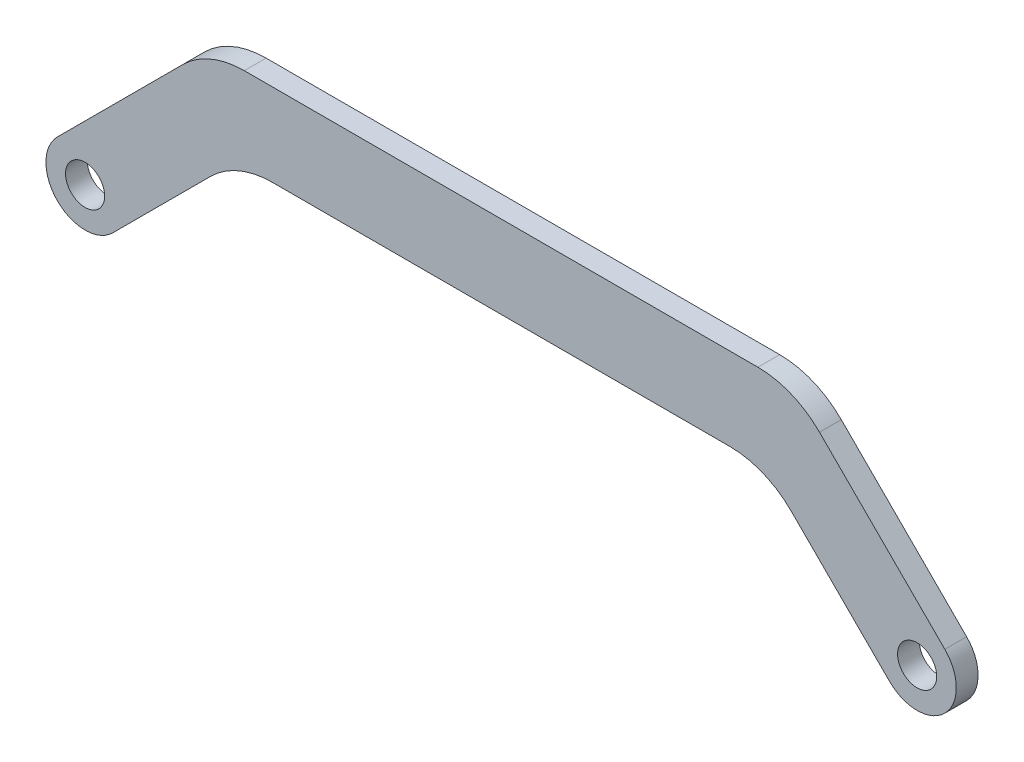
ISO-10303-21;
HEADER;
FILE_DESCRIPTION(('STEP AP214'),'2;1');
FILE_NAME('part.step','',(''),(''),'','','');
FILE_SCHEMA(('AUTOMOTIVE_DESIGN { 1 0 10303 214 1 1 1 1 }'));
ENDSEC;
DATA;
#1=APPLICATION_CONTEXT('core data for automotive mechanical design processes');
#2=APPLICATION_PROTOCOL_DEFINITION('international standard','automotive_design',2000,#1);
#3=PRODUCT_CONTEXT('',#1,'mechanical');
#4=PRODUCT('Part','Part','',(#3));
#5=PRODUCT_RELATED_PRODUCT_CATEGORY('part','',(#4));
#6=PRODUCT_DEFINITION_FORMATION('','',#4);
#7=PRODUCT_DEFINITION_CONTEXT('part definition',#1,'design');
#8=PRODUCT_DEFINITION('design','',#6,#7);
#9=PRODUCT_DEFINITION_SHAPE('','',#8);
#10=(LENGTH_UNIT() NAMED_UNIT(*) SI_UNIT(.MILLI.,.METRE.));
#11=(NAMED_UNIT(*) PLANE_ANGLE_UNIT() SI_UNIT($,.RADIAN.));
#12=(NAMED_UNIT(*) SI_UNIT($,.STERADIAN.) SOLID_ANGLE_UNIT());
#13=UNCERTAINTY_MEASURE_WITH_UNIT(LENGTH_MEASURE(1.E-05),#10,'distance_accuracy_value','');
#14=(GEOMETRIC_REPRESENTATION_CONTEXT(3) GLOBAL_UNCERTAINTY_ASSIGNED_CONTEXT((#13)) GLOBAL_UNIT_ASSIGNED_CONTEXT((#10,
#11,#12)) REPRESENTATION_CONTEXT('',''));
#15=CARTESIAN_POINT('',(0.,0.,0.));
#16=DIRECTION('',(0.,0.,1.));
#17=DIRECTION('',(1.,0.,0.));
#18=AXIS2_PLACEMENT_3D('',#15,#16,#17);
#19=CARTESIAN_POINT('',(0.,0.,5.));
#20=DIRECTION('',(0.,0.,1.));
#21=DIRECTION('',(1.,0.,0.));
#22=AXIS2_PLACEMENT_3D('',#19,#20,#21);
#23=PLANE('',#22);
#24=CARTESIAN_POINT('',(0.,0.,5.));
#25=DIRECTION('',(0.,0.,1.));
#26=DIRECTION('',(1.,0.,0.));
#27=AXIS2_PLACEMENT_3D('',#24,#25,#26);
#28=CIRCLE('',#27,4.49);
#29=CARTESIAN_POINT('',(4.49,0.,5.));
#30=VERTEX_POINT('',#29);
#31=EDGE_CURVE('E279',#30,#30,#28,.T.);
#32=ORIENTED_EDGE('',*,*,#31,.F.);
#33=EDGE_LOOP('',(#32));
#34=FACE_BOUND('',#33,.T.);
#35=DIRECTION('',(-0.707106781186546,0.707106781186549,0.));
#36=VECTOR('',#35,1.);
#37=CARTESIAN_POINT('',(197.356889962867,6.35688996286705,5.));
#38=LINE('',#37,#36);
#39=CARTESIAN_POINT('',(197.356889962867,6.35688996286705,5.));
#40=VERTEX_POINT('',#39);
#41=CARTESIAN_POINT('',(168.591644302003,35.1221356237309,5.));
#42=VERTEX_POINT('',#41);
#43=EDGE_CURVE('E256',#40,#42,#38,.T.);
#44=ORIENTED_EDGE('',*,*,#43,.T.);
#45=CARTESIAN_POINT('',(154.449508678272,20.98,5.));
#46=DIRECTION('',(0.,0.,1.));
#47=DIRECTION('',(1.,0.,0.));
#48=AXIS2_PLACEMENT_3D('',#45,#46,#47);
#49=CIRCLE('',#48,20.);
#50=CARTESIAN_POINT('',(154.449508678272,40.98,5.));
#51=VERTEX_POINT('',#50);
#52=EDGE_CURVE('E204',#42,#51,#49,.T.);
#53=ORIENTED_EDGE('',*,*,#52,.T.);
#54=DIRECTION('',(-1.,0.,0.));
#55=VECTOR('',#54,1.);
#56=CARTESIAN_POINT('',(28.2662200742657,40.98,5.));
#57=LINE('',#56,#55);
#58=CARTESIAN_POINT('',(36.5504913217277,40.98,5.));
#59=VERTEX_POINT('',#58);
#60=EDGE_CURVE('E266',#51,#59,#57,.T.);
#61=ORIENTED_EDGE('',*,*,#60,.T.);
#62=CARTESIAN_POINT('',(36.5504913217277,20.98,5.));
#63=DIRECTION('',(0.,0.,1.));
#64=DIRECTION('',(1.,0.,0.));
#65=AXIS2_PLACEMENT_3D('',#62,#63,#64);
#66=CIRCLE('',#65,20.);
#67=CARTESIAN_POINT('',(22.4083556979967,35.1221356237309,5.));
#68=VERTEX_POINT('',#67);
#69=EDGE_CURVE('E179',#59,#68,#66,.T.);
#70=ORIENTED_EDGE('',*,*,#69,.T.);
#71=DIRECTION('',(-0.707106781186546,-0.707106781186549,0.));
#72=VECTOR('',#71,1.);
#73=CARTESIAN_POINT('',(-6.35688996286707,6.35688996286705,5.));
#74=LINE('',#73,#72);
#75=CARTESIAN_POINT('',(-6.35688996286707,6.35688996286705,5.));
#76=VERTEX_POINT('',#75);
#77=EDGE_CURVE('E148',#68,#76,#74,.T.);
#78=ORIENTED_EDGE('',*,*,#77,.T.);
#79=CARTESIAN_POINT('',(0.,0.,5.));
#80=DIRECTION('',(0.,0.,1.));
#81=DIRECTION('',(1.,0.,0.));
#82=AXIS2_PLACEMENT_3D('',#79,#80,#81);
#83=CIRCLE('',#82,8.99);
#84=CARTESIAN_POINT('',(6.35688996286707,-6.35688996286705,5.));
#85=VERTEX_POINT('',#84);
#86=EDGE_CURVE('E142',#76,#85,#83,.T.);
#87=ORIENTED_EDGE('',*,*,#86,.T.);
#88=DIRECTION('',(0.707106781186546,0.707106781186549,0.));
#89=VECTOR('',#88,1.);
#90=CARTESIAN_POINT('',(6.35688996286707,-6.35688996286705,5.));
#91=LINE('',#90,#89);
#92=CARTESIAN_POINT('',(28.855915549465,16.1421356237309,5.));
#93=VERTEX_POINT('',#92);
#94=EDGE_CURVE('E129',#85,#93,#91,.T.);
#95=ORIENTED_EDGE('',*,*,#94,.T.);
#96=CARTESIAN_POINT('',(42.9980511731959,1.99999999999999,5.));
#97=DIRECTION('',(0.,0.,1.));
#98=DIRECTION('',(1.,0.,0.));
#99=AXIS2_PLACEMENT_3D('',#96,#97,#98);
#100=CIRCLE('',#99,20.);
#101=CARTESIAN_POINT('',(42.9980511731959,22.,5.));
#102=VERTEX_POINT('',#101);
#103=EDGE_CURVE('E191',#93,#102,#100,.F.);
#104=ORIENTED_EDGE('',*,*,#103,.T.);
#105=DIRECTION('',(1.,0.,0.));
#106=VECTOR('',#105,1.);
#107=CARTESIAN_POINT('',(34.713779925734,22.,5.));
#108=LINE('',#107,#106);
#109=CARTESIAN_POINT('',(148.001948826804,22.,5.));
#110=VERTEX_POINT('',#109);
#111=EDGE_CURVE('E141',#102,#110,#108,.T.);
#112=ORIENTED_EDGE('',*,*,#111,.T.);
#113=CARTESIAN_POINT('',(148.001948826804,1.99999999999999,5.));
#114=DIRECTION('',(0.,0.,1.));
#115=DIRECTION('',(1.,0.,0.));
#116=AXIS2_PLACEMENT_3D('',#113,#114,#115);
#117=CIRCLE('',#116,20.);
#118=CARTESIAN_POINT('',(162.144084450535,16.1421356237309,5.));
#119=VERTEX_POINT('',#118);
#120=EDGE_CURVE('E11',#110,#119,#117,.F.);
#121=ORIENTED_EDGE('',*,*,#120,.T.);
#122=DIRECTION('',(0.707106781186546,-0.707106781186549,0.));
#123=VECTOR('',#122,1.);
#124=CARTESIAN_POINT('',(184.643110037133,-6.35688996286705,5.));
#125=LINE('',#124,#123);
#126=CARTESIAN_POINT('',(184.643110037133,-6.35688996286705,5.));
#127=VERTEX_POINT('',#126);
#128=EDGE_CURVE('E219',#119,#127,#125,.T.);
#129=ORIENTED_EDGE('',*,*,#128,.T.);
#130=CARTESIAN_POINT('',(191.,0.,5.));
#131=DIRECTION('',(0.,0.,1.));
#132=DIRECTION('',(1.,0.,0.));
#133=AXIS2_PLACEMENT_3D('',#130,#131,#132);
#134=CIRCLE('',#133,8.98999999999999);
#135=EDGE_CURVE('E274',#127,#40,#134,.T.);
#136=ORIENTED_EDGE('',*,*,#135,.T.);
#137=EDGE_LOOP('',(#44,#53,#61,#70,#78,#87,#95,#104,#112,#121,#129,#136));
#138=FACE_BOUND('',#137,.T.);
#139=CARTESIAN_POINT('',(191.,0.,5.));
#140=DIRECTION('',(0.,0.,1.));
#141=DIRECTION('',(1.,0.,0.));
#142=AXIS2_PLACEMENT_3D('',#139,#140,#141);
#143=CIRCLE('',#142,4.48999999999998);
#144=CARTESIAN_POINT('',(195.49,0.,5.));
#145=VERTEX_POINT('',#144);
#146=EDGE_CURVE('E432',#145,#145,#143,.T.);
#147=ORIENTED_EDGE('',*,*,#146,.F.);
#148=EDGE_LOOP('',(#147));
#149=FACE_BOUND('',#148,.T.);
#150=ADVANCED_FACE('F39',(#34,#138,#149),#23,.T.);
#151=CARTESIAN_POINT('',(0.,0.,0.));
#152=DIRECTION('',(0.,0.,1.));
#153=DIRECTION('',(1.,0.,0.));
#154=AXIS2_PLACEMENT_3D('',#151,#152,#153);
#155=PLANE('',#154);
#156=DIRECTION('',(-1.,0.,0.));
#157=VECTOR('',#156,1.);
#158=CARTESIAN_POINT('',(28.2662200742657,40.98,0.));
#159=LINE('',#158,#157);
#160=CARTESIAN_POINT('',(154.449508678272,40.98,0.));
#161=VERTEX_POINT('',#160);
#162=CARTESIAN_POINT('',(36.5504913217277,40.98,0.));
#163=VERTEX_POINT('',#162);
#164=EDGE_CURVE('E242',#161,#163,#159,.T.);
#165=ORIENTED_EDGE('',*,*,#164,.F.);
#166=CARTESIAN_POINT('',(154.449508678272,20.98,0.));
#167=DIRECTION('',(0.,0.,1.));
#168=DIRECTION('',(1.,0.,0.));
#169=AXIS2_PLACEMENT_3D('',#166,#167,#168);
#170=CIRCLE('',#169,20.);
#171=CARTESIAN_POINT('',(168.591644302003,35.1221356237309,0.));
#172=VERTEX_POINT('',#171);
#173=EDGE_CURVE('E198',#161,#172,#170,.F.);
#174=ORIENTED_EDGE('',*,*,#173,.T.);
#175=DIRECTION('',(-0.707106781186546,0.707106781186549,0.));
#176=VECTOR('',#175,1.);
#177=CARTESIAN_POINT('',(197.356889962867,6.35688996286705,0.));
#178=LINE('',#177,#176);
#179=CARTESIAN_POINT('',(197.356889962867,6.35688996286705,0.));
#180=VERTEX_POINT('',#179);
#181=EDGE_CURVE('E233',#180,#172,#178,.T.);
#182=ORIENTED_EDGE('',*,*,#181,.F.);
#183=CARTESIAN_POINT('',(191.,0.,0.));
#184=DIRECTION('',(0.,0.,1.));
#185=DIRECTION('',(1.,0.,0.));
#186=AXIS2_PLACEMENT_3D('',#183,#184,#185);
#187=CIRCLE('',#186,8.98999999999999);
#188=CARTESIAN_POINT('',(184.643110037133,-6.35688996286705,0.));
#189=VERTEX_POINT('',#188);
#190=EDGE_CURVE('E227',#189,#180,#187,.T.);
#191=ORIENTED_EDGE('',*,*,#190,.F.);
#192=DIRECTION('',(0.707106781186546,-0.707106781186549,0.));
#193=VECTOR('',#192,1.);
#194=CARTESIAN_POINT('',(184.643110037133,-6.35688996286705,0.));
#195=LINE('',#194,#193);
#196=CARTESIAN_POINT('',(162.144084450535,16.1421356237309,0.));
#197=VERTEX_POINT('',#196);
#198=EDGE_CURVE('E218',#197,#189,#195,.T.);
#199=ORIENTED_EDGE('',*,*,#198,.F.);
#200=CARTESIAN_POINT('',(148.001948826804,1.99999999999999,0.));
#201=DIRECTION('',(0.,0.,1.));
#202=DIRECTION('',(1.,0.,0.));
#203=AXIS2_PLACEMENT_3D('',#200,#201,#202);
#204=CIRCLE('',#203,20.);
#205=CARTESIAN_POINT('',(148.001948826804,22.,0.));
#206=VERTEX_POINT('',#205);
#207=EDGE_CURVE('E48',#197,#206,#204,.T.);
#208=ORIENTED_EDGE('',*,*,#207,.T.);
#209=DIRECTION('',(1.,0.,0.));
#210=VECTOR('',#209,1.);
#211=CARTESIAN_POINT('',(34.713779925734,22.,0.));
#212=LINE('',#211,#210);
#213=CARTESIAN_POINT('',(42.9980511731959,22.,0.));
#214=VERTEX_POINT('',#213);
#215=EDGE_CURVE('E229',#214,#206,#212,.T.);
#216=ORIENTED_EDGE('',*,*,#215,.F.);
#217=CARTESIAN_POINT('',(42.9980511731959,1.99999999999999,0.));
#218=DIRECTION('',(0.,0.,1.));
#219=DIRECTION('',(1.,0.,0.));
#220=AXIS2_PLACEMENT_3D('',#217,#218,#219);
#221=CIRCLE('',#220,20.);
#222=CARTESIAN_POINT('',(28.855915549465,16.1421356237309,0.));
#223=VERTEX_POINT('',#222);
#224=EDGE_CURVE('E188',#214,#223,#221,.T.);
#225=ORIENTED_EDGE('',*,*,#224,.T.);
#226=DIRECTION('',(0.707106781186546,0.707106781186549,0.));
#227=VECTOR('',#226,1.);
#228=CARTESIAN_POINT('',(6.35688996286707,-6.35688996286705,0.));
#229=LINE('',#228,#227);
#230=CARTESIAN_POINT('',(6.35688996286707,-6.35688996286705,0.));
#231=VERTEX_POINT('',#230);
#232=EDGE_CURVE('E235',#231,#223,#229,.T.);
#233=ORIENTED_EDGE('',*,*,#232,.F.);
#234=CARTESIAN_POINT('',(0.,0.,0.));
#235=DIRECTION('',(0.,0.,1.));
#236=DIRECTION('',(1.,0.,0.));
#237=AXIS2_PLACEMENT_3D('',#234,#235,#236);
#238=CIRCLE('',#237,8.99);
#239=CARTESIAN_POINT('',(-6.35688996286707,6.35688996286705,0.));
#240=VERTEX_POINT('',#239);
#241=EDGE_CURVE('E157',#240,#231,#238,.T.);
#242=ORIENTED_EDGE('',*,*,#241,.F.);
#243=DIRECTION('',(-0.707106781186546,-0.707106781186549,0.));
#244=VECTOR('',#243,1.);
#245=CARTESIAN_POINT('',(-6.35688996286707,6.35688996286705,0.));
#246=LINE('',#245,#244);
#247=CARTESIAN_POINT('',(22.4083556979967,35.1221356237309,0.));
#248=VERTEX_POINT('',#247);
#249=EDGE_CURVE('E153',#248,#240,#246,.T.);
#250=ORIENTED_EDGE('',*,*,#249,.F.);
#251=CARTESIAN_POINT('',(36.5504913217277,20.98,0.));
#252=DIRECTION('',(0.,0.,1.));
#253=DIRECTION('',(1.,0.,0.));
#254=AXIS2_PLACEMENT_3D('',#251,#252,#253);
#255=CIRCLE('',#254,20.);
#256=EDGE_CURVE('E165',#248,#163,#255,.F.);
#257=ORIENTED_EDGE('',*,*,#256,.T.);
#258=EDGE_LOOP('',(#165,#174,#182,#191,#199,#208,#216,#225,#233,#242,#250,#257));
#259=FACE_BOUND('',#258,.T.);
#260=CARTESIAN_POINT('',(0.,0.,0.));
#261=DIRECTION('',(0.,0.,1.));
#262=DIRECTION('',(1.,0.,0.));
#263=AXIS2_PLACEMENT_3D('',#260,#261,#262);
#264=CIRCLE('',#263,4.49);
#265=CARTESIAN_POINT('',(4.49,0.,0.));
#266=VERTEX_POINT('',#265);
#267=EDGE_CURVE('E440',#266,#266,#264,.T.);
#268=ORIENTED_EDGE('',*,*,#267,.T.);
#269=EDGE_LOOP('',(#268));
#270=FACE_BOUND('',#269,.T.);
#271=CARTESIAN_POINT('',(191.,0.,0.));
#272=DIRECTION('',(0.,0.,1.));
#273=DIRECTION('',(1.,0.,0.));
#274=AXIS2_PLACEMENT_3D('',#271,#272,#273);
#275=CIRCLE('',#274,4.48999999999998);
#276=CARTESIAN_POINT('',(195.49,0.,0.));
#277=VERTEX_POINT('',#276);
#278=EDGE_CURVE('E435',#277,#277,#275,.T.);
#279=ORIENTED_EDGE('',*,*,#278,.T.);
#280=EDGE_LOOP('',(#279));
#281=FACE_BOUND('',#280,.T.);
#282=ADVANCED_FACE('F224',(#259,#270,#281),#155,.F.);
#283=CARTESIAN_POINT('',(0.,0.,5.));
#284=DIRECTION('',(0.,0.,-1.));
#285=DIRECTION('',(-1.,0.,0.));
#286=AXIS2_PLACEMENT_3D('',#283,#284,#285);
#287=CYLINDRICAL_SURFACE('',#286,8.99);
#288=ORIENTED_EDGE('',*,*,#241,.T.);
#289=DIRECTION('',(0.,0.,-1.));
#290=VECTOR('',#289,1.);
#291=CARTESIAN_POINT('',(6.35688996286707,-6.35688996286705,5.));
#292=LINE('',#291,#290);
#293=EDGE_CURVE('E134',#85,#231,#292,.T.);
#294=ORIENTED_EDGE('',*,*,#293,.F.);
#295=ORIENTED_EDGE('',*,*,#86,.F.);
#296=DIRECTION('',(0.,0.,-1.));
#297=VECTOR('',#296,1.);
#298=CARTESIAN_POINT('',(-6.35688996286707,6.35688996286705,5.));
#299=LINE('',#298,#297);
#300=EDGE_CURVE('E247',#76,#240,#299,.T.);
#301=ORIENTED_EDGE('',*,*,#300,.T.);
#302=EDGE_LOOP('',(#288,#294,#295,#301));
#303=FACE_BOUND('',#302,.T.);
#304=ADVANCED_FACE('F155',(#303),#287,.T.);
#305=CARTESIAN_POINT('',(6.35688996286707,-6.35688996286705,5.));
#306=DIRECTION('',(-0.707106781186549,0.707106781186546,0.));
#307=DIRECTION('',(-0.707106781186546,-0.707106781186549,0.));
#308=AXIS2_PLACEMENT_3D('',#305,#306,#307);
#309=PLANE('',#308);
#310=ORIENTED_EDGE('',*,*,#232,.T.);
#311=DIRECTION('',(0.,0.,-1.));
#312=VECTOR('',#311,1.);
#313=CARTESIAN_POINT('',(28.855915549465,16.1421356237309,5.));
#314=LINE('',#313,#312);
#315=EDGE_CURVE('E137',#223,#93,#314,.F.);
#316=ORIENTED_EDGE('',*,*,#315,.T.);
#317=ORIENTED_EDGE('',*,*,#94,.F.);
#318=ORIENTED_EDGE('',*,*,#293,.T.);
#319=EDGE_LOOP('',(#310,#316,#317,#318));
#320=FACE_BOUND('',#319,.T.);
#321=ADVANCED_FACE('F132',(#320),#309,.F.);
#322=CARTESIAN_POINT('',(34.713779925734,22.,5.));
#323=DIRECTION('',(0.,1.,0.));
#324=DIRECTION('',(0.,0.,1.));
#325=AXIS2_PLACEMENT_3D('',#322,#323,#324);
#326=PLANE('',#325);
#327=ORIENTED_EDGE('',*,*,#215,.T.);
#328=DIRECTION('',(0.,0.,-1.));
#329=VECTOR('',#328,1.);
#330=CARTESIAN_POINT('',(148.001948826804,22.,5.));
#331=LINE('',#330,#329);
#332=EDGE_CURVE('E61',#206,#110,#331,.F.);
#333=ORIENTED_EDGE('',*,*,#332,.T.);
#334=ORIENTED_EDGE('',*,*,#111,.F.);
#335=DIRECTION('',(0.,0.,-1.));
#336=VECTOR('',#335,1.);
#337=CARTESIAN_POINT('',(42.9980511731959,22.,0.));
#338=LINE('',#337,#336);
#339=EDGE_CURVE('E182',#102,#214,#338,.T.);
#340=ORIENTED_EDGE('',*,*,#339,.T.);
#341=EDGE_LOOP('',(#327,#333,#334,#340));
#342=FACE_BOUND('',#341,.T.);
#343=ADVANCED_FACE('F284',(#342),#326,.F.);
#344=CARTESIAN_POINT('',(184.643110037133,-6.35688996286705,5.));
#345=DIRECTION('',(0.707106781186549,0.707106781186546,0.));
#346=DIRECTION('',(-0.707106781186546,0.707106781186549,0.));
#347=AXIS2_PLACEMENT_3D('',#344,#345,#346);
#348=PLANE('',#347);
#349=ORIENTED_EDGE('',*,*,#128,.F.);
#350=DIRECTION('',(0.,0.,-1.));
#351=VECTOR('',#350,1.);
#352=CARTESIAN_POINT('',(162.144084450535,16.1421356237309,0.));
#353=LINE('',#352,#351);
#354=EDGE_CURVE('E207',#119,#197,#353,.T.);
#355=ORIENTED_EDGE('',*,*,#354,.T.);
#356=ORIENTED_EDGE('',*,*,#198,.T.);
#357=DIRECTION('',(0.,0.,-1.));
#358=VECTOR('',#357,1.);
#359=CARTESIAN_POINT('',(184.643110037133,-6.35688996286705,5.));
#360=LINE('',#359,#358);
#361=EDGE_CURVE('E160',#127,#189,#360,.T.);
#362=ORIENTED_EDGE('',*,*,#361,.F.);
#363=EDGE_LOOP('',(#349,#355,#356,#362));
#364=FACE_BOUND('',#363,.T.);
#365=ADVANCED_FACE('F216',(#364),#348,.F.);
#366=CARTESIAN_POINT('',(191.,0.,5.));
#367=DIRECTION('',(0.,0.,-1.));
#368=DIRECTION('',(-1.,0.,0.));
#369=AXIS2_PLACEMENT_3D('',#366,#367,#368);
#370=CYLINDRICAL_SURFACE('',#369,8.98999999999999);
#371=ORIENTED_EDGE('',*,*,#190,.T.);
#372=DIRECTION('',(0.,0.,-1.));
#373=VECTOR('',#372,1.);
#374=CARTESIAN_POINT('',(197.356889962867,6.35688996286705,5.));
#375=LINE('',#374,#373);
#376=EDGE_CURVE('E168',#40,#180,#375,.T.);
#377=ORIENTED_EDGE('',*,*,#376,.F.);
#378=ORIENTED_EDGE('',*,*,#135,.F.);
#379=ORIENTED_EDGE('',*,*,#361,.T.);
#380=EDGE_LOOP('',(#371,#377,#378,#379));
#381=FACE_BOUND('',#380,.T.);
#382=ADVANCED_FACE('F290',(#381),#370,.T.);
#383=CARTESIAN_POINT('',(197.356889962867,6.35688996286705,5.));
#384=DIRECTION('',(-0.707106781186549,-0.707106781186546,0.));
#385=DIRECTION('',(0.707106781186546,-0.707106781186549,0.));
#386=AXIS2_PLACEMENT_3D('',#383,#384,#385);
#387=PLANE('',#386);
#388=ORIENTED_EDGE('',*,*,#181,.T.);
#389=DIRECTION('',(0.,0.,-1.));
#390=VECTOR('',#389,1.);
#391=CARTESIAN_POINT('',(168.591644302003,35.1221356237309,5.));
#392=LINE('',#391,#390);
#393=EDGE_CURVE('E201',#172,#42,#392,.F.);
#394=ORIENTED_EDGE('',*,*,#393,.T.);
#395=ORIENTED_EDGE('',*,*,#43,.F.);
#396=ORIENTED_EDGE('',*,*,#376,.T.);
#397=EDGE_LOOP('',(#388,#394,#395,#396));
#398=FACE_BOUND('',#397,.T.);
#399=ADVANCED_FACE('F254',(#398),#387,.F.);
#400=CARTESIAN_POINT('',(28.2662200742657,40.98,5.));
#401=DIRECTION('',(0.,-1.,0.));
#402=DIRECTION('',(0.,0.,-1.));
#403=AXIS2_PLACEMENT_3D('',#400,#401,#402);
#404=PLANE('',#403);
#405=ORIENTED_EDGE('',*,*,#60,.F.);
#406=DIRECTION('',(0.,0.,-1.));
#407=VECTOR('',#406,1.);
#408=CARTESIAN_POINT('',(154.449508678272,40.98,5.));
#409=LINE('',#408,#407);
#410=EDGE_CURVE('E194',#51,#161,#409,.T.);
#411=ORIENTED_EDGE('',*,*,#410,.T.);
#412=ORIENTED_EDGE('',*,*,#164,.T.);
#413=DIRECTION('',(0.,0.,-1.));
#414=VECTOR('',#413,1.);
#415=CARTESIAN_POINT('',(36.5504913217277,40.98,5.));
#416=LINE('',#415,#414);
#417=EDGE_CURVE('E175',#163,#59,#416,.F.);
#418=ORIENTED_EDGE('',*,*,#417,.T.);
#419=EDGE_LOOP('',(#405,#411,#412,#418));
#420=FACE_BOUND('',#419,.T.);
#421=ADVANCED_FACE('F265',(#420),#404,.F.);
#422=CARTESIAN_POINT('',(-6.35688996286707,6.35688996286705,5.));
#423=DIRECTION('',(0.707106781186549,-0.707106781186546,0.));
#424=DIRECTION('',(0.707106781186546,0.707106781186549,0.));
#425=AXIS2_PLACEMENT_3D('',#422,#423,#424);
#426=PLANE('',#425);
#427=ORIENTED_EDGE('',*,*,#77,.F.);
#428=DIRECTION('',(0.,0.,-1.));
#429=VECTOR('',#428,1.);
#430=CARTESIAN_POINT('',(22.4083556979967,35.1221356237309,5.));
#431=LINE('',#430,#429);
#432=EDGE_CURVE('E159',#68,#248,#431,.T.);
#433=ORIENTED_EDGE('',*,*,#432,.T.);
#434=ORIENTED_EDGE('',*,*,#249,.T.);
#435=ORIENTED_EDGE('',*,*,#300,.F.);
#436=EDGE_LOOP('',(#427,#433,#434,#435));
#437=FACE_BOUND('',#436,.T.);
#438=ADVANCED_FACE('F311',(#437),#426,.F.);
#439=CARTESIAN_POINT('',(0.,0.,5.));
#440=DIRECTION('',(0.,0.,-1.));
#441=DIRECTION('',(-1.,0.,0.));
#442=AXIS2_PLACEMENT_3D('',#439,#440,#441);
#443=CYLINDRICAL_SURFACE('',#442,4.49);
#444=ORIENTED_EDGE('',*,*,#31,.T.);
#445=EDGE_LOOP('',(#444));
#446=FACE_BOUND('',#445,.T.);
#447=ORIENTED_EDGE('',*,*,#267,.F.);
#448=EDGE_LOOP('',(#447));
#449=FACE_BOUND('',#448,.T.);
#450=ADVANCED_FACE('F308',(#446,#449),#443,.F.);
#451=CARTESIAN_POINT('',(191.,0.,5.));
#452=DIRECTION('',(0.,0.,-1.));
#453=DIRECTION('',(-1.,0.,0.));
#454=AXIS2_PLACEMENT_3D('',#451,#452,#453);
#455=CYLINDRICAL_SURFACE('',#454,4.48999999999998);
#456=ORIENTED_EDGE('',*,*,#146,.T.);
#457=EDGE_LOOP('',(#456));
#458=FACE_BOUND('',#457,.T.);
#459=ORIENTED_EDGE('',*,*,#278,.F.);
#460=EDGE_LOOP('',(#459));
#461=FACE_BOUND('',#460,.T.);
#462=ADVANCED_FACE('F333',(#458,#461),#455,.F.);
#463=CARTESIAN_POINT('',(36.5504913217277,20.98,5.));
#464=DIRECTION('',(0.,0.,-1.));
#465=DIRECTION('',(-1.,0.,0.));
#466=AXIS2_PLACEMENT_3D('',#463,#464,#465);
#467=CYLINDRICAL_SURFACE('',#466,20.);
#468=ORIENTED_EDGE('',*,*,#69,.F.);
#469=ORIENTED_EDGE('',*,*,#417,.F.);
#470=ORIENTED_EDGE('',*,*,#256,.F.);
#471=ORIENTED_EDGE('',*,*,#432,.F.);
#472=EDGE_LOOP('',(#468,#469,#470,#471));
#473=FACE_BOUND('',#472,.T.);
#474=ADVANCED_FACE('F339',(#473),#467,.T.);
#475=CARTESIAN_POINT('',(42.9980511731959,1.99999999999999,5.));
#476=DIRECTION('',(0.,0.,1.));
#477=DIRECTION('',(1.,0.,0.));
#478=AXIS2_PLACEMENT_3D('',#475,#476,#477);
#479=CYLINDRICAL_SURFACE('',#478,20.);
#480=ORIENTED_EDGE('',*,*,#103,.F.);
#481=ORIENTED_EDGE('',*,*,#315,.F.);
#482=ORIENTED_EDGE('',*,*,#224,.F.);
#483=ORIENTED_EDGE('',*,*,#339,.F.);
#484=EDGE_LOOP('',(#480,#481,#482,#483));
#485=FACE_BOUND('',#484,.T.);
#486=ADVANCED_FACE('F282',(#485),#479,.F.);
#487=CARTESIAN_POINT('',(154.449508678272,20.98,5.));
#488=DIRECTION('',(0.,0.,-1.));
#489=DIRECTION('',(-1.,0.,0.));
#490=AXIS2_PLACEMENT_3D('',#487,#488,#489);
#491=CYLINDRICAL_SURFACE('',#490,20.);
#492=ORIENTED_EDGE('',*,*,#52,.F.);
#493=ORIENTED_EDGE('',*,*,#393,.F.);
#494=ORIENTED_EDGE('',*,*,#173,.F.);
#495=ORIENTED_EDGE('',*,*,#410,.F.);
#496=EDGE_LOOP('',(#492,#493,#494,#495));
#497=FACE_BOUND('',#496,.T.);
#498=ADVANCED_FACE('F262',(#497),#491,.T.);
#499=CARTESIAN_POINT('',(148.001948826804,1.99999999999999,5.));
#500=DIRECTION('',(0.,0.,1.));
#501=DIRECTION('',(1.,0.,0.));
#502=AXIS2_PLACEMENT_3D('',#499,#500,#501);
#503=CYLINDRICAL_SURFACE('',#502,20.);
#504=ORIENTED_EDGE('',*,*,#120,.F.);
#505=ORIENTED_EDGE('',*,*,#332,.F.);
#506=ORIENTED_EDGE('',*,*,#207,.F.);
#507=ORIENTED_EDGE('',*,*,#354,.F.);
#508=EDGE_LOOP('',(#504,#505,#506,#507));
#509=FACE_BOUND('',#508,.T.);
#510=ADVANCED_FACE('F41',(#509),#503,.F.);
#511=CLOSED_SHELL('',(#150,#282,#304,#321,#343,#365,#382,#399,#421,#438,#450,#462,#474,#486,
#498,#510));
#512=MANIFOLD_SOLID_BREP('B2',#511);
#513=ADVANCED_BREP_SHAPE_REPRESENTATION('',(#18,#512),#14);
#514=SHAPE_DEFINITION_REPRESENTATION(#9,#513);
ENDSEC;
END-ISO-10303-21;
